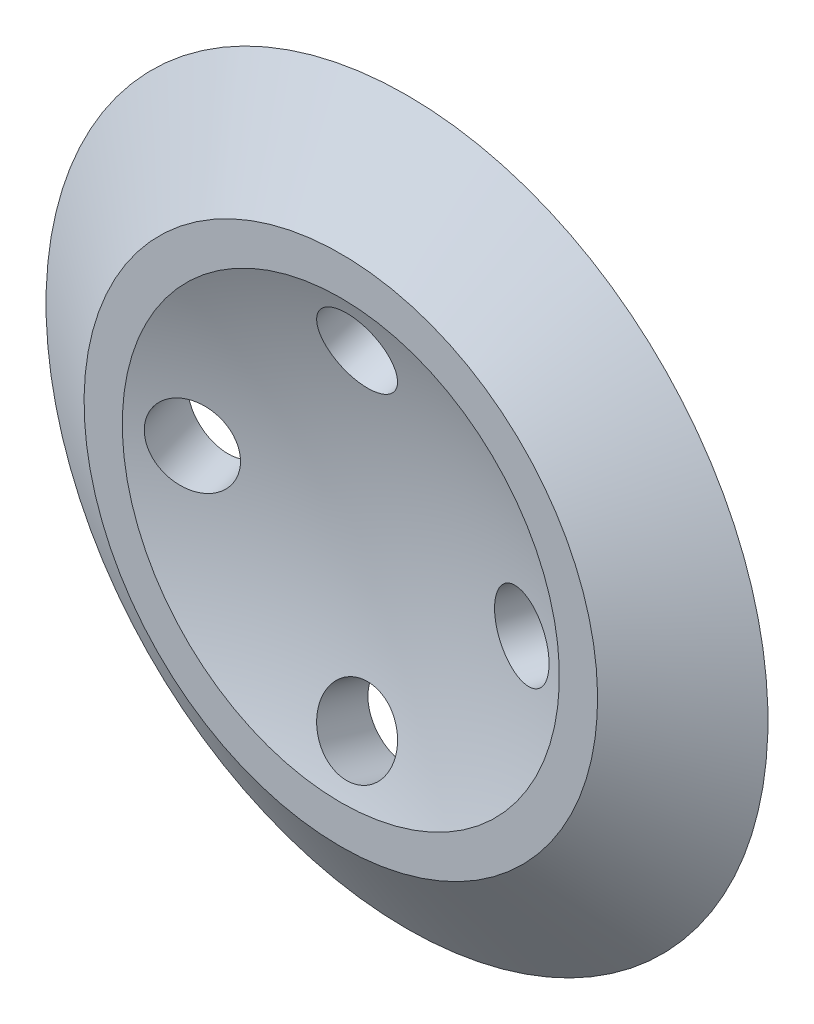
ISO-10303-21;
HEADER;
FILE_DESCRIPTION(('STEP AP214'),'2;1');
FILE_NAME('part.step','',(''),(''),'','','');
FILE_SCHEMA(('AUTOMOTIVE_DESIGN { 1 0 10303 214 1 1 1 1 }'));
ENDSEC;
DATA;
#1=APPLICATION_CONTEXT('core data for automotive mechanical design processes');
#2=APPLICATION_PROTOCOL_DEFINITION('international standard','automotive_design',2000,#1);
#3=PRODUCT_CONTEXT('',#1,'mechanical');
#4=PRODUCT('Part','Part','',(#3));
#5=PRODUCT_RELATED_PRODUCT_CATEGORY('part','',(#4));
#6=PRODUCT_DEFINITION_FORMATION('','',#4);
#7=PRODUCT_DEFINITION_CONTEXT('part definition',#1,'design');
#8=PRODUCT_DEFINITION('design','',#6,#7);
#9=PRODUCT_DEFINITION_SHAPE('','',#8);
#10=(LENGTH_UNIT() NAMED_UNIT(*) SI_UNIT(.MILLI.,.METRE.));
#11=(NAMED_UNIT(*) PLANE_ANGLE_UNIT() SI_UNIT($,.RADIAN.));
#12=(NAMED_UNIT(*) SI_UNIT($,.STERADIAN.) SOLID_ANGLE_UNIT());
#13=UNCERTAINTY_MEASURE_WITH_UNIT(LENGTH_MEASURE(1.E-05),#10,'distance_accuracy_value','');
#14=(GEOMETRIC_REPRESENTATION_CONTEXT(3) GLOBAL_UNCERTAINTY_ASSIGNED_CONTEXT((#13)) GLOBAL_UNIT_ASSIGNED_CONTEXT((#10,
#11,#12)) REPRESENTATION_CONTEXT('',''));
#15=CARTESIAN_POINT('',(0.,0.,0.));
#16=DIRECTION('',(0.,0.,1.));
#17=DIRECTION('',(1.,0.,0.));
#18=AXIS2_PLACEMENT_3D('',#15,#16,#17);
#19=CARTESIAN_POINT('',(0.,1.13216418099787,-5.5));
#20=DIRECTION('',(0.,0.,-1.));
#21=DIRECTION('',(0.,1.,0.));
#22=AXIS2_PLACEMENT_3D('',#19,#20,#21);
#23=CONICAL_SURFACE('',#22,60.,1.00497751363157);
#24=CARTESIAN_POINT('',(0.,1.13216418099783,5.5));
#25=DIRECTION('',(0.,0.,1.));
#26=DIRECTION('',(0.,-1.,0.));
#27=AXIS2_PLACEMENT_3D('',#24,#25,#26);
#28=CIRCLE('',#27,42.6794919243113);
#29=CARTESIAN_POINT('',(0.,-41.5473277433134,5.49999999999985));
#30=VERTEX_POINT('',#29);
#31=EDGE_CURVE('E10',#30,#30,#28,.T.);
#32=ORIENTED_EDGE('',*,*,#31,.F.);
#33=EDGE_LOOP('',(#32));
#34=FACE_BOUND('',#33,.T.);
#35=CARTESIAN_POINT('',(0.,1.13216418099787,-5.5));
#36=DIRECTION('',(0.,0.,1.));
#37=DIRECTION('',(0.,-1.,0.));
#38=AXIS2_PLACEMENT_3D('',#35,#36,#37);
#39=CIRCLE('',#38,60.);
#40=CARTESIAN_POINT('',(0.,-58.8678358190021,-5.50000000000021));
#41=VERTEX_POINT('',#40);
#42=EDGE_CURVE('E46',#41,#41,#39,.T.);
#43=ORIENTED_EDGE('',*,*,#42,.T.);
#44=EDGE_LOOP('',(#43));
#45=FACE_BOUND('',#44,.T.);
#46=ADVANCED_FACE('F34',(#34,#45),#23,.T.);
#47=CARTESIAN_POINT('',(0.,37.4582891310865,5.50000000000014));
#48=DIRECTION('',(0.,0.,-1.));
#49=DIRECTION('',(0.,1.,0.));
#50=AXIS2_PLACEMENT_3D('',#47,#48,#49);
#51=PLANE('',#50);
#52=CARTESIAN_POINT('',(0.,1.13216418099783,5.50000000000001));
#53=DIRECTION('',(0.,0.,1.));
#54=DIRECTION('',(0.,-1.,0.));
#55=AXIS2_PLACEMENT_3D('',#52,#53,#54);
#56=CIRCLE('',#55,36.3261249500886);
#57=CARTESIAN_POINT('',(0.,-35.1939607690908,5.49999999999988));
#58=VERTEX_POINT('',#57);
#59=EDGE_CURVE('E41',#58,#58,#56,.T.);
#60=ORIENTED_EDGE('',*,*,#59,.F.);
#61=EDGE_LOOP('',(#60));
#62=FACE_BOUND('',#61,.T.);
#63=ORIENTED_EDGE('',*,*,#31,.T.);
#64=EDGE_LOOP('',(#63));
#65=FACE_BOUND('',#64,.T.);
#66=ADVANCED_FACE('F120',(#62,#65),#51,.F.);
#67=CARTESIAN_POINT('',(0.,1.1321641809975,101.667835819002));
#68=DIRECTION('',(0.,0.,1.));
#69=DIRECTION('',(0.,1.,0.));
#70=AXIS2_PLACEMENT_3D('',#67,#68,#69);
#71=SPHERICAL_SURFACE('',#70,102.8);
#72=CARTESIAN_POINT('',(-3.26528690714912,-20.8304626244454,1.29442835856548));
#73=CARTESIAN_POINT('',(-3.10738949225979,-20.7420491868018,1.2699459754155));
#74=CARTESIAN_POINT('',(-2.94564168176089,-20.6600638275605,1.24724358872385));
#75=CARTESIAN_POINT('',(-2.61550575414756,-20.5094803839233,1.20554587046483));
#76=CARTESIAN_POINT('',(-2.4471159016714,-20.4408858263568,1.18655151550782));
#77=CARTESIAN_POINT('',(-2.10479101583131,-20.3175515366248,1.15239932133448));
#78=CARTESIAN_POINT('',(-1.93085117293428,-20.2628242101159,1.13724491734705));
#79=CARTESIAN_POINT('',(-1.57873928914634,-20.1676740614716,1.11089713832694));
#80=CARTESIAN_POINT('',(-1.40056572369977,-20.1272564781723,1.09970521396888));
#81=CARTESIAN_POINT('',(-1.04146916899541,-20.0610701324829,1.08137773320025));
#82=CARTESIAN_POINT('',(-0.860548627618744,-20.0352890331374,1.07423876059457));
#83=CARTESIAN_POINT('',(-0.497029921059985,-19.99849935436,1.06405143336842));
#84=CARTESIAN_POINT('',(-0.31443116194928,-19.9874962248979,1.06100458788419));
#85=CARTESIAN_POINT('',(0.0509659367665498,-19.9803607253702,1.05902871685423));
#86=CARTESIAN_POINT('',(0.233764083497001,-19.9842191765381,1.06009714964225));
#87=CARTESIAN_POINT('',(0.598441205958814,-20.0067629965848,1.06633969545889));
#88=CARTESIAN_POINT('',(0.780319817560297,-20.0254538369962,1.07151532359429));
#89=CARTESIAN_POINT('',(1.14174669069129,-20.0775291158329,1.08593534530725));
#90=CARTESIAN_POINT('',(1.3212955794088,-20.1109095114703,1.09517861940709));
#91=CARTESIAN_POINT('',(1.67690387060439,-20.1921407179141,1.11767213562312));
#92=CARTESIAN_POINT('',(1.85296196012223,-20.2399968673172,1.13092385603734));
#93=CARTESIAN_POINT('',(2.20021090906639,-20.349816751277,1.1613338010454));
#94=CARTESIAN_POINT('',(2.37140335457794,-20.4117758278806,1.17849073581446));
#95=CARTESIAN_POINT('',(2.70782699025656,-20.5493951375101,1.21659857245887));
#96=CARTESIAN_POINT('',(2.87305595603701,-20.6250604209076,1.23755087282523));
#97=CARTESIAN_POINT('',(3.19625056920159,-20.7895085310575,1.2830878424785));
#98=CARTESIAN_POINT('',(3.35421893019861,-20.8782864039091,1.30767113998452));
#99=CARTESIAN_POINT('',(3.66189068158555,-21.0683811504519,1.36030990979261));
#100=CARTESIAN_POINT('',(3.81159099909894,-21.1697026413174,1.38836666063645));
#101=CARTESIAN_POINT('',(4.10155434819067,-21.3841123891801,1.44773850961088));
#102=CARTESIAN_POINT('',(4.24182086000782,-21.4971962672555,1.47905239516978));
#103=CARTESIAN_POINT('',(4.51199670572761,-21.7343490247865,1.54472204616472));
#104=CARTESIAN_POINT('',(4.64190219650903,-21.8584219446274,1.57907893043245));
#105=CARTESIAN_POINT('',(5.01454324465484,-22.2457691868821,1.68633886425087));
#106=CARTESIAN_POINT('',(5.24050812853158,-22.5243977578929,1.76349371122603));
#107=CARTESIAN_POINT('',(5.6405634979542,-23.1141125905778,1.92679149386535));
#108=CARTESIAN_POINT('',(5.81465406541787,-23.4251988009951,2.01293441533563));
#109=CARTESIAN_POINT('',(6.10621657457308,-24.0711742831143,2.19181186256911));
#110=CARTESIAN_POINT('',(6.22368620490389,-24.4060645258961,2.28454665724623));
#111=CARTESIAN_POINT('',(6.39861180528878,-25.0900874444908,2.47396046050377));
#112=CARTESIAN_POINT('',(6.45606770045165,-25.4392201380763,2.57063947400602));
#113=CARTESIAN_POINT('',(6.50934951173117,-26.1418395950878,2.76520353428644));
#114=CARTESIAN_POINT('',(6.50517358263654,-26.4953264885587,2.86308861708578));
#115=CARTESIAN_POINT('',(6.43530210958524,-27.1966065236469,3.05728244347064));
#116=CARTESIAN_POINT('',(6.36960658569041,-27.5443996671208,3.15359118757021));
#117=CARTESIAN_POINT('',(6.17856069145566,-28.2244227606802,3.34189932017412));
#118=CARTESIAN_POINT('',(6.05320990566092,-28.5566526023611,3.43389867866187));
#119=CARTESIAN_POINT('',(5.74641067445013,-29.1961147700783,3.61097548281315));
#120=CARTESIAN_POINT('',(5.56496222562398,-29.5033470945949,3.6960529280559));
#121=CARTESIAN_POINT('',(5.15112193234099,-30.0840861064283,3.85686887771467));
#122=CARTESIAN_POINT('',(4.91873108766984,-30.3575934554604,3.93260756536578));
#123=CARTESIAN_POINT('',(4.40960022163822,-30.8631242242321,4.07259751846418));
#124=CARTESIAN_POINT('',(4.1328602105923,-31.0951476536199,4.13684878658317));
#125=CARTESIAN_POINT('',(3.54289784305338,-31.5111148130411,4.2520373333132));
#126=CARTESIAN_POINT('',(3.22967685110113,-31.695060340554,4.30297510967328));
#127=CARTESIAN_POINT('',(2.57563559495907,-32.0096601370761,4.39009342510066));
#128=CARTESIAN_POINT('',(2.2348153356812,-32.1403144155696,4.42627396679435));
#129=CARTESIAN_POINT('',(1.53526466106945,-32.3446177553654,4.48284929078603));
#130=CARTESIAN_POINT('',(1.17653494073508,-32.4182690269146,4.50324468514074));
#131=CARTESIAN_POINT('',(0.451336776608307,-32.506483343237,4.5276728570262));
#132=CARTESIAN_POINT('',(0.0848683350721981,-32.5210464052377,4.53170563932755));
#133=CARTESIAN_POINT('',(-0.645395110461542,-32.4906714867304,4.52329426273511));
#134=CARTESIAN_POINT('',(-1.00919017679056,-32.445734897948,4.51085048923589));
#135=CARTESIAN_POINT('',(-1.72378918367539,-32.2976378700877,4.46983970170879));
#136=CARTESIAN_POINT('',(-2.07459311934103,-32.1944774090933,4.44127268161182));
#137=CARTESIAN_POINT('',(-2.75325074051901,-31.9328655880651,4.36882763528559));
#138=CARTESIAN_POINT('',(-3.08110436151609,-31.774414072611,4.32494956601777));
#139=CARTESIAN_POINT('',(-3.70456136689737,-31.4067030469957,4.22312388735304));
#140=CARTESIAN_POINT('',(-4.00016478156646,-31.1974435845467,4.16517629116844));
#141=CARTESIAN_POINT('',(-4.55071162644868,-30.7341109481176,4.03687156037842));
#142=CARTESIAN_POINT('',(-4.8056539682775,-30.4800365749495,3.96651409370127));
#143=CARTESIAN_POINT('',(-5.26773679437821,-29.9340668715293,3.81532611985376));
#144=CARTESIAN_POINT('',(-5.47487718244424,-29.6421714651607,3.73449559160591));
#145=CARTESIAN_POINT('',(-5.74513918099532,-29.1826320846994,3.60724195408692));
#146=CARTESIAN_POINT('',(-5.82852013231635,-29.025743079739,3.56379696824957));
#147=CARTESIAN_POINT('',(-5.98127173671131,-28.7057721814185,3.47519216084436));
#148=CARTESIAN_POINT('',(-6.05064754828477,-28.5426925946204,3.43003297797299));
#149=CARTESIAN_POINT('',(-6.17491554267926,-28.2114306248875,3.33830164742787));
#150=CARTESIAN_POINT('',(-6.22980233744674,-28.0432463695213,3.29172898127799));
#151=CARTESIAN_POINT('',(-6.32466192602473,-27.7030791886557,3.19753182121136));
#152=CARTESIAN_POINT('',(-6.36464021586877,-27.5310976878292,3.14990772177801));
#153=CARTESIAN_POINT('',(-6.42943800459197,-27.1844280658183,3.05391010397115));
#154=CARTESIAN_POINT('',(-6.45425108239493,-27.0097388302104,3.00553627703287));
#155=CARTESIAN_POINT('',(-6.48850992133997,-26.6590312987048,2.90842067179278));
#156=CARTESIAN_POINT('',(-6.49796135036181,-26.4830135170845,2.85967903587055));
#157=CARTESIAN_POINT('',(-6.50144776973854,-26.1307780398438,2.76214049005597));
#158=CARTESIAN_POINT('',(-6.4954776717194,-25.9545602974205,2.71334356723129));
#159=CARTESIAN_POINT('',(-6.46815784018242,-25.6033010791958,2.61607552791962));
#160=CARTESIAN_POINT('',(-6.44681378429279,-25.4282591932283,2.56760429782174));
#161=CARTESIAN_POINT('',(-6.3888958569247,-25.0804811556389,2.4713004052485));
#162=CARTESIAN_POINT('',(-6.35231773131354,-24.9077456619966,2.42346792499855));
#163=CARTESIAN_POINT('',(-6.26420758530123,-24.5659218082459,2.32881297700467));
#164=CARTESIAN_POINT('',(-6.21268108684683,-24.3968321261048,2.28199014314546));
#165=CARTESIAN_POINT('',(-6.09499853875623,-24.0633323194751,2.18964037207171));
#166=CARTESIAN_POINT('',(-6.02883346814038,-23.898925151397,2.14411425356653));
#167=CARTESIAN_POINT('',(-5.88238984820189,-23.5761287644914,2.05472852113735));
#168=CARTESIAN_POINT('',(-5.80211650993373,-23.417737349853,2.01086829914405));
#169=CARTESIAN_POINT('',(-5.62793732619961,-23.1079050006905,1.92507257877314));
#170=CARTESIAN_POINT('',(-5.53402016537821,-22.9564699739343,1.88313871637077));
#171=CARTESIAN_POINT('',(-5.33330962789378,-22.661824522151,1.80154852285108));
#172=CARTESIAN_POINT('',(-5.22652097195217,-22.51861111006,1.7618913645651));
#173=CARTESIAN_POINT('',(-5.00089740895624,-22.2414894951082,1.68515379957949));
#174=CARTESIAN_POINT('',(-4.88207332131387,-22.1075731139467,1.64807112818548));
#175=CARTESIAN_POINT('',(-4.63318841907889,-21.8498991786982,1.57671890100782));
#176=CARTESIAN_POINT('',(-4.5031305686481,-21.7261389614922,1.5424486077707));
#177=CARTESIAN_POINT('',(-4.19896436644312,-21.4601447013591,1.46879249701068));
#178=CARTESIAN_POINT('',(-4.02194942853555,-21.3209803322209,1.43025670928576));
#179=CARTESIAN_POINT('',(-3.65372097192077,-21.0613553544633,1.35836440585106));
#180=CARTESIAN_POINT('',(-3.46250745334205,-20.9408947456747,1.32500789009439));
#181=CARTESIAN_POINT('',(-3.26528690714912,-20.8304626244454,1.29442835856548));
#182=B_SPLINE_CURVE_WITH_KNOTS('',3,(#72,#73,#74,#75,#76,#77,#78,#79,#80,#81,#82,#83,#84,#85,
#86,#87,#88,#89,#90,#91,#92,#93,#94,#95,#96,#97,#98,#99,#100,#101,#102,#103,#104,#105,#106,#107,
#108,#109,#110,#111,#112,#113,#114,#115,#116,#117,#118,#119,#120,#121,#122,#123,#124,#125,#126,
#127,#128,#129,#130,#131,#132,#133,#134,#135,#136,#137,#138,#139,#140,#141,#142,#143,#144,#145,
#146,#147,#148,#149,#150,#151,#152,#153,#154,#155,#156,#157,#158,#159,#160,#161,#162,#163,#164,
#165,#166,#167,#168,#169,#170,#171,#172,#173,#174,#175,#176,#177,#178,#179,#180,#181),
.UNSPECIFIED.,.T.,.F.,(4,2,2,2,2,2,2,2,2,2,2,2,2,2,2,2,2,2,2,2,2,2,2,2,2,2,2,2,2,2,2,2,2,2,2,2,
2,2,2,2,2,2,2,2,2,2,2,2,2,2,2,2,2,2,4),(0.,0.547643134037494,1.09543031066958,1.64370582243297,
2.19218185230327,2.74019488785095,3.2884099697712,3.83628651898708,4.38436526885068,
4.93229327339164,5.48042359834342,6.0283731473473,6.57652501337938,7.12447031632897,
7.67261791525406,8.2205621743059,8.7687087412715,9.86386325592623,10.9590160411489,
12.0542135285425,13.149412382633,14.2446440262345,15.3398753126757,16.4351142267049,
17.5303532073123,18.6255706948935,19.7207879277532,20.8159642080706,21.911140293476,
23.0062739121595,24.1014072115516,25.1965148957016,26.2916229920704,27.386734166756,
28.4818443130576,29.5769837675067,30.6721254260058,31.220305458421,31.7682832103326,
32.3164644534438,32.864443408808,33.4126542225475,33.9606627208351,34.5088520590852,
35.0568390538293,35.6049791773295,36.1529170744804,36.7011935820627,37.2492680012482,
37.7977995826722,38.3461305945244,38.8939729796016,39.4416712489828,40.1257006807937,
40.809730106414),.UNSPECIFIED.);
#183=CARTESIAN_POINT('',(-3.26528690714912,-20.8304626244454,1.29442835856548));
#184=VERTEX_POINT('',#183);
#185=EDGE_CURVE('E60',#184,#184,#182,.T.);
#186=ORIENTED_EDGE('',*,*,#185,.T.);
#187=EDGE_LOOP('',(#186));
#188=FACE_BOUND('',#187,.T.);
#189=CARTESIAN_POINT('',(-32.4072315263735,5.009532250093,4.1866716812428));
#190=CARTESIAN_POINT('',(-32.302241190766,5.15610628933347,4.15759803253653));
#191=CARTESIAN_POINT('',(-32.1913055438153,5.29806832223738,4.12687803860225));
#192=CARTESIAN_POINT('',(-31.9582737931682,5.57184378448388,4.0623475664251));
#193=CARTESIAN_POINT('',(-31.8361747595524,5.70365453272125,4.02853627684721));
#194=CARTESIAN_POINT('',(-31.5816019986341,5.95624997456258,3.95804081506238));
#195=CARTESIAN_POINT('',(-31.4491191121877,6.07702472575731,3.92135410657426));
#196=CARTESIAN_POINT('',(-31.1747645213773,6.30660170464757,3.84538082301476));
#197=CARTESIAN_POINT('',(-31.03288940067,6.41539953709913,3.80609330192063));
#198=CARTESIAN_POINT('',(-30.7409283973175,6.62010959086537,3.72524462614998));
#199=CARTESIAN_POINT('',(-30.5908495690693,6.71603264538334,3.68368542489997));
#200=CARTESIAN_POINT('',(-30.2833813880843,6.89445310157523,3.59854268818343));
#201=CARTESIAN_POINT('',(-30.1259893604685,6.97694554037659,3.55495841202475));
#202=CARTESIAN_POINT('',(-29.8051651662672,7.12782845377398,3.46611732347872));
#203=CARTESIAN_POINT('',(-29.6417367901571,7.19622760639339,3.4208615606883));
#204=CARTESIAN_POINT('',(-29.309847999314,7.31852477425985,3.32895666415311));
#205=CARTESIAN_POINT('',(-29.1413857496592,7.37241742823029,3.28230702231899));
#206=CARTESIAN_POINT('',(-28.8007250777143,7.46527415539406,3.18797321799141));
#207=CARTESIAN_POINT('',(-28.6285275501442,7.50424176279356,3.14028930324003));
#208=CARTESIAN_POINT('',(-28.2815172060956,7.56700126203371,3.04419734550159));
#209=CARTESIAN_POINT('',(-28.1067034473864,7.59078754484514,2.9957890416279));
#210=CARTESIAN_POINT('',(-27.7558239759834,7.62298709058183,2.89862583531137));
#211=CARTESIAN_POINT('',(-27.579758694971,7.63140541839038,2.84987105237913));
#212=CARTESIAN_POINT('',(-27.2275054795002,7.6328251421055,2.75232760609081));
#213=CARTESIAN_POINT('',(-27.0513175237577,7.62582084457865,2.70353893687183));
#214=CARTESIAN_POINT('',(-26.7002006484859,7.596438157475,2.60631032507916));
#215=CARTESIAN_POINT('',(-26.5252712907188,7.57406540980158,2.55787026112119));
#216=CARTESIAN_POINT('',(-26.1777888049689,7.5141022423414,2.46164822131215));
#217=CARTESIAN_POINT('',(-26.0052365781434,7.47650620718599,2.41386649503247));
#218=CARTESIAN_POINT('',(-25.663851393656,7.38637044693232,2.31933303023782));
#219=CARTESIAN_POINT('',(-25.4950170797245,7.33383627183046,2.27258091612677));
#220=CARTESIAN_POINT('',(-25.1621909721336,7.21420684049175,2.18041770994608));
#221=CARTESIAN_POINT('',(-24.9982009893377,7.14710621548936,2.13500711935214));
#222=CARTESIAN_POINT('',(-24.5154032269211,6.92464750176625,2.00131532868938));
#223=CARTESIAN_POINT('',(-24.205395403292,6.7480339228649,1.91547103502918));
#224=CARTESIAN_POINT('',(-23.6185307479941,6.34339571379731,1.75296251501746));
#225=CARTESIAN_POINT('',(-23.3416738522197,6.11537118304955,1.67629827091399));
#226=CARTESIAN_POINT('',(-22.8287463638095,5.61431081572208,1.53426405391319));
#227=CARTESIAN_POINT('',(-22.5926745906269,5.34127628242789,1.46889375410667));
#228=CARTESIAN_POINT('',(-22.1680722624976,4.75796261609678,1.35131783595904));
#229=CARTESIAN_POINT('',(-21.9795417474893,4.44768345177166,1.29911222867735));
#230=CARTESIAN_POINT('',(-21.6553655449328,3.79869647348368,1.20934530556742));
#231=CARTESIAN_POINT('',(-21.5197177065485,3.45998981640045,1.17178339415307));
#232=CARTESIAN_POINT('',(-21.3051521575157,2.76375373036727,1.11236859596657));
#233=CARTESIAN_POINT('',(-21.2262344121672,2.40622431293075,1.09051569958572));
#234=CARTESIAN_POINT('',(-21.1273703609794,1.68250424114431,1.06313952875175));
#235=CARTESIAN_POINT('',(-21.1074220772708,1.31631387770273,1.05761570661218));
#236=CARTESIAN_POINT('',(-21.1270580676958,0.585655730279462,1.06305305332476));
#237=CARTESIAN_POINT('',(-21.1666423432648,0.221187946339312,1.07401422257441));
#238=CARTESIAN_POINT('',(-21.3042185302783,-0.495674236385249,1.11211007111505));
#239=CARTESIAN_POINT('',(-21.4022097252962,-0.848068783205409,1.13924455202221));
#240=CARTESIAN_POINT('',(-21.6538168785282,-1.53078610596985,1.20891647253721));
#241=CARTESIAN_POINT('',(-21.8074328364751,-1.86110888202015,1.25145391207106));
#242=CARTESIAN_POINT('',(-22.1659307245271,-2.4903112478754,1.35072483293342));
#243=CARTESIAN_POINT('',(-22.3708134029773,-2.78919037860399,1.40745852148594));
#244=CARTESIAN_POINT('',(-22.8260269322596,-3.34701682947725,1.53351102574529));
#245=CARTESIAN_POINT('',(-23.0763577928392,-3.60596414105753,1.6028298441513));
#246=CARTESIAN_POINT('',(-23.6153707423388,-4.07658604928105,1.75208748618833));
#247=CARTESIAN_POINT('',(-23.9040541752259,-4.28825898861857,1.8320266819831));
#248=CARTESIAN_POINT('',(-24.5115704963253,-4.6583131188517,2.0002540110806));
#249=CARTESIAN_POINT('',(-24.8304033873566,-4.81669430476473,2.08854214516392));
#250=CARTESIAN_POINT('',(-25.4891813444104,-5.07567574117192,2.27096489958715));
#251=CARTESIAN_POINT('',(-25.8291272526834,-5.17627368490709,2.36509975316715));
#252=CARTESIAN_POINT('',(-26.5204710559868,-5.31682309488275,2.556540977556));
#253=CARTESIAN_POINT('',(-26.871868957722,-5.35677452561591,2.65384735022168));
#254=CARTESIAN_POINT('',(-27.5761484535123,-5.37490062173398,2.84887128760194));
#255=CARTESIAN_POINT('',(-27.9290300886328,-5.35307356588061,2.94658886369751));
#256=CARTESIAN_POINT('',(-28.6262626245415,-5.24824609117141,3.1396620720438));
#257=CARTESIAN_POINT('',(-28.9706135338417,-5.16524573335753,3.23501770665131));
#258=CARTESIAN_POINT('',(-29.6409626262811,-4.94047321595682,3.42064714484066));
#259=CARTESIAN_POINT('',(-29.966960761964,-4.79870090440608,3.51092093528194));
#260=CARTESIAN_POINT('',(-30.591528405491,-4.46023545319561,3.68387337174347));
#261=CARTESIAN_POINT('',(-30.8900978663655,-4.26354221949012,3.76655200475758));
#262=CARTESIAN_POINT('',(-31.3106679887659,-3.93186572840365,3.88301471203297));
#263=CARTESIAN_POINT('',(-31.4463746434511,-3.81512998964658,3.92059411867851));
#264=CARTESIAN_POINT('',(-31.7078201991124,-3.5702284221135,3.99299274126533));
#265=CARTESIAN_POINT('',(-31.8335627609235,-3.44206682834977,4.02781297093567));
#266=CARTESIAN_POINT('',(-32.0742307909159,-3.17516640747523,4.09445803300466));
#267=CARTESIAN_POINT('',(-32.1891522274242,-3.03642367267519,4.12628174897929));
#268=CARTESIAN_POINT('',(-32.4072823645715,-2.7494349098083,4.18668575390623));
#269=CARTESIAN_POINT('',(-32.5104953729909,-2.60119240852821,4.21526723574558));
#270=CARTESIAN_POINT('',(-32.7045538127721,-2.2961603580348,4.26900542571374));
#271=CARTESIAN_POINT('',(-32.7953949129148,-2.13936784235361,4.29416093446079));
#272=CARTESIAN_POINT('',(-32.9639905967301,-1.81845711030918,4.34084808132252));
#273=CARTESIAN_POINT('',(-33.0417499988874,-1.65434161958097,4.3623810537544));
#274=CARTESIAN_POINT('',(-33.1836934663127,-1.31984235531677,4.40168775732604));
#275=CARTESIAN_POINT('',(-33.2478730466396,-1.14945653265119,4.41946024650943));
#276=CARTESIAN_POINT('',(-33.362146839944,-0.803743442944671,4.451104738812));
#277=CARTESIAN_POINT('',(-33.4122462439995,-0.628418023332696,4.46497817943203));
#278=CARTESIAN_POINT('',(-33.4980447795115,-0.273971294689282,4.48873736622857));
#279=CARTESIAN_POINT('',(-33.5337406434165,-0.0948491340281511,4.49862220756135));
#280=CARTESIAN_POINT('',(-33.590451472852,0.265812200699263,4.51432648099655));
#281=CARTESIAN_POINT('',(-33.6114718503501,0.447350458571847,4.52014741177171));
#282=CARTESIAN_POINT('',(-33.6387120265798,0.811731668740003,4.52769071995094));
#283=CARTESIAN_POINT('',(-33.6449226724795,0.994575357860543,4.52941056276694));
#284=CARTESIAN_POINT('',(-33.6424729481313,1.36008785036604,4.5287321888024));
#285=CARTESIAN_POINT('',(-33.6338180579619,1.54275669337021,4.52633548955704));
#286=CARTESIAN_POINT('',(-33.6016958950573,1.90683921815287,4.51744026925358));
#287=CARTESIAN_POINT('',(-33.5782163966347,2.08825173889908,4.51093836267728));
#288=CARTESIAN_POINT('',(-33.5166128319151,2.44831026971883,4.49387920152158));
#289=CARTESIAN_POINT('',(-33.4784941229889,2.6269572670125,4.4833234304959));
#290=CARTESIAN_POINT('',(-33.3879213814368,2.98012736791861,4.45824218029016));
#291=CARTESIAN_POINT('',(-33.3354801536128,3.15465400456269,4.44372024698938));
#292=CARTESIAN_POINT('',(-33.2166429821426,3.49845057651696,4.41081207559675));
#293=CARTESIAN_POINT('',(-33.1502507130844,3.66772188258936,4.39242685506262));
#294=CARTESIAN_POINT('',(-32.9857524173831,4.04121359279312,4.34687431832719));
#295=CARTESIAN_POINT('',(-32.8838656987217,4.24365441518228,4.31866006448083));
#296=CARTESIAN_POINT('',(-32.6601529569824,4.63630444760043,4.25671004435817));
#297=CARTESIAN_POINT('',(-32.5383269340821,4.82651365773842,4.22297427813107));
#298=CARTESIAN_POINT('',(-32.4072315263735,5.009532250093,4.1866716812428));
#299=B_SPLINE_CURVE_WITH_KNOTS('',3,(#189,#190,#191,#192,#193,#194,#195,#196,#197,#198,#199,
#200,#201,#202,#203,#204,#205,#206,#207,#208,#209,#210,#211,#212,#213,#214,#215,#216,#217,#218,
#219,#220,#221,#222,#223,#224,#225,#226,#227,#228,#229,#230,#231,#232,#233,#234,#235,#236,#237,
#238,#239,#240,#241,#242,#243,#244,#245,#246,#247,#248,#249,#250,#251,#252,#253,#254,#255,#256,
#257,#258,#259,#260,#261,#262,#263,#264,#265,#266,#267,#268,#269,#270,#271,#272,#273,#274,#275,
#276,#277,#278,#279,#280,#281,#282,#283,#284,#285,#286,#287,#288,#289,#290,#291,#292,#293,#294,
#295,#296,#297,#298),.UNSPECIFIED.,.T.,.F.,(4,2,2,2,2,2,2,2,2,2,2,2,2,2,2,2,2,2,2,2,2,2,2,2,2,2,
2,2,2,2,2,2,2,2,2,2,2,2,2,2,2,2,2,2,2,2,2,2,2,2,2,2,2,2,4),(0.,0.547678314889684,
1.09550078719962,1.64381202862507,2.19232382111888,2.74037114749618,3.28862053058173,
3.83653131033066,4.38464430845279,4.93262743470218,5.48081290671881,6.02881767824253,
6.5770247857295,7.12503074868097,7.67323903736997,8.22124391468849,8.76945111447355,
9.86468467721383,10.9599161220098,12.055115859439,13.1503165169221,14.2454726259267,
15.3406280650585,16.4357467716357,17.5308655046197,18.6259708050186,19.7210761001572,
20.8161973815849,21.9113188978883,23.006478800029,24.1016388045628,25.1968425258306,
26.2920468883182,27.3872817650891,28.4825155489783,29.5777521647803,30.6729906560603,
31.2211848177494,31.7691766284751,32.31737180564,32.8653646314312,33.4135488108336,
33.9615306290588,34.5096931450393,35.0576532986048,35.605737691257,36.153619856614,
36.7018405409481,37.2498591708353,37.7983303368768,38.3466009751862,38.8943830371004,
39.4420209982249,40.1258754902406,40.8097299761622),.UNSPECIFIED.);
#300=CARTESIAN_POINT('',(-32.4072315263735,5.009532250093,4.1866716812428));
#301=VERTEX_POINT('',#300);
#302=EDGE_CURVE('E57',#301,#301,#299,.T.);
#303=ORIENTED_EDGE('',*,*,#302,.T.);
#304=EDGE_LOOP('',(#303));
#305=FACE_BOUND('',#304,.T.);
#306=CARTESIAN_POINT('',(-3.87736806909526,33.5393957073714,4.18667168124289));
#307=CARTESIAN_POINT('',(-3.73080380909475,33.6443821859391,4.21574426196189));
#308=CARTESIAN_POINT('',(-3.57966257582688,33.7433992925162,4.24316383464154));
#309=CARTESIAN_POINT('',(-3.2692178357398,33.9288519345965,4.29451894418618));
#310=CARTESIAN_POINT('',(-3.10991219259654,34.0152841541405,4.3184535628097));
#311=CARTESIAN_POINT('',(-2.78417216068642,34.174983588058,4.36267719184861));
#312=CARTESIAN_POINT('',(-2.6177315436864,34.2482389979758,4.38296293341441));
#313=CARTESIAN_POINT('',(-2.27897364747867,34.3809954923082,4.41972560696203));
#314=CARTESIAN_POINT('',(-2.10665424130922,34.4404915366678,4.43620114326583));
#315=CARTESIAN_POINT('',(-1.75757182647595,34.5452262536102,4.46520409686424));
#316=CARTESIAN_POINT('',(-1.58081269013709,34.5904769145671,4.47773483395217));
#317=CARTESIAN_POINT('',(-1.22390140587528,34.6664815840278,4.49878192260863));
#318=CARTESIAN_POINT('',(-1.04374803101184,34.6972302416172,4.50729679241209));
#319=CARTESIAN_POINT('',(-0.681505454662926,34.7439728584918,4.52024068526477));
#320=CARTESIAN_POINT('',(-0.499417517294409,34.7599759174223,4.52467222817276));
#321=CARTESIAN_POINT('',(-0.134422598967603,34.7771494589085,4.52942789934661));
#322=CARTESIAN_POINT('',(0.0484846594656466,34.7783144651722,4.52975051112599));
#323=CARTESIAN_POINT('',(0.413699339046014,34.7657912364069,4.52628259754062));
#324=CARTESIAN_POINT('',(0.596006914234069,34.752107172931,4.5224932273561));
#325=CARTESIAN_POINT('',(0.958845435053426,34.70998188504,4.51082795747684));
#326=CARTESIAN_POINT('',(1.13937569981332,34.6815352134543,4.50295054936031));
#327=CARTESIAN_POINT('',(1.49724818750609,34.6100956948659,4.48316763367856));
#328=CARTESIAN_POINT('',(1.67459144235711,34.5671076489404,4.47126345561855));
#329=CARTESIAN_POINT('',(2.02495532808646,34.4668704823475,4.44350595377148));
#330=CARTESIAN_POINT('',(2.19797433877428,34.4096161020177,4.42765117349016));
#331=CARTESIAN_POINT('',(2.53832618712809,34.2812854374915,4.39211408864202));
#332=CARTESIAN_POINT('',(2.70566119310325,34.2102144951466,4.37243326332631));
#333=CARTESIAN_POINT('',(3.03358378292973,34.0547165245107,4.32937308925664));
#334=CARTESIAN_POINT('',(3.19416885290078,33.9702845749899,4.30599237773188));
#335=CARTESIAN_POINT('',(3.50733646761688,33.7887046879352,4.25570969527345));
#336=CARTESIAN_POINT('',(3.65992195916009,33.6915614795966,4.22880903392917));
#337=CARTESIAN_POINT('',(3.95608503115968,33.4852360365313,4.17167392362003));
#338=CARTESIAN_POINT('',(4.09965926499246,33.3760493701011,4.14143824744973));
#339=CARTESIAN_POINT('',(4.5151808851219,33.0316056193545,4.04605587253858));
#340=CARTESIAN_POINT('',(4.77225834668207,32.7792723803107,3.97618054748653));
#341=CARTESIAN_POINT('',(5.23866141273724,32.2367260504023,3.82594054390191));
#342=CARTESIAN_POINT('',(5.44798709324832,31.9465130198397,3.74557588206765));
#343=CARTESIAN_POINT('',(5.81316147299119,31.3362920103161,3.57659612374404));
#344=CARTESIAN_POINT('',(5.96900802293214,31.0162828345248,3.48798069584378));
#345=CARTESIAN_POINT('',(6.22273417999867,30.3556006658247,3.30502802180417));
#346=CARTESIAN_POINT('',(6.32061371358703,30.0149276467022,3.21069076840624));
#347=CARTESIAN_POINT('',(6.45564519733039,29.3225658319573,3.0189661673404));
#348=CARTESIAN_POINT('',(6.49279501027637,28.9708766490962,2.92157871245227));
#349=CARTESIAN_POINT('',(6.50530210737929,28.2664799119399,2.72652214238335));
#350=CARTESIAN_POINT('',(6.480659408878,27.9137723579304,2.62885302728162));
#351=CARTESIAN_POINT('',(6.37028105183139,27.2173445151395,2.43600380985344));
#352=CARTESIAN_POINT('',(6.28454442834658,26.8736243683972,2.34082374686459));
#353=CARTESIAN_POINT('',(6.0544101109031,26.2049347566734,2.15565619836029));
#354=CARTESIAN_POINT('',(5.91001241044759,25.8799652937684,2.06566871341993));
#355=CARTESIAN_POINT('',(5.56665624229722,25.2580061407378,1.89344189130769));
#356=CARTESIAN_POINT('',(5.36769838164,24.9610161393615,1.81120246794437));
#357=CARTESIAN_POINT('',(4.92086829474946,24.4034435990369,1.65680540157079));
#358=CARTESIAN_POINT('',(4.67299607831076,24.1428610527985,1.58464775654175));
#359=CARTESIAN_POINT('',(4.1353822142234,23.6655099649981,1.45246509877363));
#360=CARTESIAN_POINT('',(3.84564194800837,23.4487399784093,1.39243968588901));
#361=CARTESIAN_POINT('',(3.23251050103116,23.0651580893133,1.28622275739771));
#362=CARTESIAN_POINT('',(2.90911932624139,22.8983461779395,1.24003123933577));
#363=CARTESIAN_POINT('',(2.2378802410694,22.6194227691229,1.16279521648248));
#364=CARTESIAN_POINT('',(1.89003331913557,22.5073090623496,1.13175009990854));
#365=CARTESIAN_POINT('',(1.1797457769481,22.3409555583264,1.08568559411005));
#366=CARTESIAN_POINT('',(0.817305161406759,22.2867157423892,1.07066619971084));
#367=CARTESIAN_POINT('',(0.0881307318145031,22.2376506205349,1.05707971466953));
#368=CARTESIAN_POINT('',(-0.278602951889158,22.2428235153636,1.05851212580107));
#369=CARTESIAN_POINT('',(-1.00596446400483,22.3124336704803,1.07778767925407));
#370=CARTESIAN_POINT('',(-1.36659229041875,22.3768709501616,1.09563082694569));
#371=CARTESIAN_POINT('',(-2.07150006712701,22.5631756045595,1.14721996039795));
#372=CARTESIAN_POINT('',(-2.41578012035317,22.6850426176238,1.18096584601426));
#373=CARTESIAN_POINT('',(-3.07823110068872,22.9827614289365,1.26340647964124));
#374=CARTESIAN_POINT('',(-3.39640205349979,23.1586131740417,1.3121012129361));
#375=CARTESIAN_POINT('',(-3.99757584271057,23.559256349982,1.42304258670598));
#376=CARTESIAN_POINT('',(-4.28057799548439,23.784048731912,1.48528949054908));
#377=CARTESIAN_POINT('',(-4.80350349950211,24.2764006162239,1.62162605526998));
#378=CARTESIAN_POINT('',(-5.04342676499706,24.5439602037324,1.6957157397204));
#379=CARTESIAN_POINT('',(-5.36565522559567,24.9712463634605,1.8140353417234));
#380=CARTESIAN_POINT('',(-5.46683425223389,25.1180881263337,1.85469725028669));
#381=CARTESIAN_POINT('',(-5.65599483775002,25.4194452914383,1.93814603569342));
#382=CARTESIAN_POINT('',(-5.74398125273121,25.5739578420942,1.98093212288465));
#383=CARTESIAN_POINT('',(-5.90615896692878,25.8896247878891,2.06834356062438));
#384=CARTESIAN_POINT('',(-5.9803451312127,26.0507816281615,2.11296958828084));
#385=CARTESIAN_POINT('',(-6.11434238241797,26.3784880344596,2.20371502018035));
#386=CARTESIAN_POINT('',(-6.17415876373711,26.5450355885894,2.24983386728093));
#387=CARTESIAN_POINT('',(-6.27904585404326,26.8824654981014,2.34327199404267));
#388=CARTESIAN_POINT('',(-6.3241102603447,27.0533496727674,2.390591777517));
#389=CARTESIAN_POINT('',(-6.39912500251278,27.3981060955477,2.48605885733005));
#390=CARTESIAN_POINT('',(-6.42908090987527,27.5719772176838,2.53420584184256));
#391=CARTESIAN_POINT('',(-6.47369796106809,27.9215909232501,2.63101812480032));
#392=CARTESIAN_POINT('',(-6.48835405416582,28.0973341053507,2.67968358905227));
#393=CARTESIAN_POINT('',(-6.50224729870482,28.4493205418586,2.77715307773767));
#394=CARTESIAN_POINT('',(-6.50149013925597,28.6255635877478,2.82595704439892));
#395=CARTESIAN_POINT('',(-6.48457375111062,28.9774126496795,2.92338865995946));
#396=CARTESIAN_POINT('',(-6.46841009602906,29.1530184680874,2.97201625415531));
#397=CARTESIAN_POINT('',(-6.42079801325072,29.5022288792347,3.06871735878302));
#398=CARTESIAN_POINT('',(-6.3893552265711,29.6758341863609,3.11679106700775));
#399=CARTESIAN_POINT('',(-6.31138656285447,30.019982553771,3.21209058469171));
#400=CARTESIAN_POINT('',(-6.26485137651235,30.1905236552901,3.25931585179115));
#401=CARTESIAN_POINT('',(-6.15705435004966,30.5271577656393,3.35253472151195));
#402=CARTESIAN_POINT('',(-6.09579794414122,30.6932523907616,3.39852877167975));
#403=CARTESIAN_POINT('',(-5.95892684027759,31.0200162471919,3.48901457170217));
#404=CARTESIAN_POINT('',(-5.88330008180738,31.1806807868552,3.53350502243127));
#405=CARTESIAN_POINT('',(-5.71829125741534,31.4952348514225,3.62060988516701));
#406=CARTESIAN_POINT('',(-5.62891423104226,31.6491268320379,3.66322497717338));
#407=CARTESIAN_POINT('',(-5.43710330538776,31.9489720018203,3.7462568453283));
#408=CARTESIAN_POINT('',(-5.33468111162386,32.0949321427942,3.78667554648774));
#409=CARTESIAN_POINT('',(-5.11748449609768,32.3779776072029,3.86505542238015));
#410=CARTESIAN_POINT('',(-5.00271333068309,32.5150652550637,3.90301724077003));
#411=CARTESIAN_POINT('',(-4.73155629459379,32.8123803502397,3.9853487187819));
#412=CARTESIAN_POINT('',(-4.57192333741013,32.9698728013599,4.02896102583827));
#413=CARTESIAN_POINT('',(-4.23636321026827,33.2678131251897,4.1114657668952));
#414=CARTESIAN_POINT('',(-4.06043604037881,33.4082609979713,4.15035820091567));
#415=CARTESIAN_POINT('',(-3.87736806909526,33.5393957073714,4.18667168124289));
#416=B_SPLINE_CURVE_WITH_KNOTS('',3,(#306,#307,#308,#309,#310,#311,#312,#313,#314,#315,#316,
#317,#318,#319,#320,#321,#322,#323,#324,#325,#326,#327,#328,#329,#330,#331,#332,#333,#334,#335,
#336,#337,#338,#339,#340,#341,#342,#343,#344,#345,#346,#347,#348,#349,#350,#351,#352,#353,#354,
#355,#356,#357,#358,#359,#360,#361,#362,#363,#364,#365,#366,#367,#368,#369,#370,#371,#372,#373,
#374,#375,#376,#377,#378,#379,#380,#381,#382,#383,#384,#385,#386,#387,#388,#389,#390,#391,#392,
#393,#394,#395,#396,#397,#398,#399,#400,#401,#402,#403,#404,#405,#406,#407,#408,#409,#410,#411,
#412,#413,#414,#415),.UNSPECIFIED.,.T.,.F.,(4,2,2,2,2,2,2,2,2,2,2,2,2,2,2,2,2,2,2,2,2,2,2,2,2,2,
2,2,2,2,2,2,2,2,2,2,2,2,2,2,2,2,2,2,2,2,2,2,2,2,2,2,2,2,4),(0.,0.547647577335195,
1.09543919278423,1.64371912989564,2.19219958494318,2.74021721804771,3.28843689949413,
3.83631804248277,4.38440138654432,4.93233079725265,5.48046252920857,6.02841346269347,
6.5765667124983,7.12450845160589,7.67265248464895,8.22059315873103,8.76873613876369,
9.86387667624631,10.9590154703621,12.0541982722275,13.1493824634441,14.2446051957101,
15.3398276206075,16.4350673442263,17.530307189145,18.6255348488934,19.7207622893333,
20.8159536010615,21.9111447184136,23.0062915959292,24.1014381198255,25.1965514783992,
26.2916651953312,27.3867720160942,28.4818777588257,29.5770047853532,30.6721339917175,
31.220306488145,31.7682767083235,32.3164504165639,32.8644218450498,33.4126270861393,
33.9606300198692,34.508813801668,35.0567952497163,35.6049341838225,36.1528708999844,
36.701146239727,37.249219498366,37.7977547830169,38.3460895033157,38.893935620493,
39.4416376264408,40.1256838692543,40.8097301091818),.UNSPECIFIED.);
#417=CARTESIAN_POINT('',(-3.87736806909526,33.5393957073714,4.18667168124289));
#418=VERTEX_POINT('',#417);
#419=EDGE_CURVE('E54',#418,#418,#416,.T.);
#420=ORIENTED_EDGE('',*,*,#419,.T.);
#421=EDGE_LOOP('',(#420));
#422=FACE_BOUND('',#421,.T.);
#423=CARTESIAN_POINT('',(21.5376786216275,3.47981403039195,1.17675691258315));
#424=CARTESIAN_POINT('',(21.601245848674,3.65010631942264,1.19435915831224));
#425=CARTESIAN_POINT('',(21.6717273214848,3.81759662387396,1.21387601629203));
#426=CARTESIAN_POINT('',(21.8260523774513,4.14588029100501,1.25660982029965));
#427=CARTESIAN_POINT('',(21.9098994724716,4.30667187952851,1.27982773879427));
#428=CARTESIAN_POINT('',(22.0904236784092,4.62049518368406,1.32981633155313));
#429=CARTESIAN_POINT('',(22.1871121680556,4.77351984889505,1.35659015669788));
#430=CARTESIAN_POINT('',(22.3926119129902,5.07062458553141,1.41349472930725));
#431=CARTESIAN_POINT('',(22.5014275893511,5.21470136492176,1.4436267010138));
#432=CARTESIAN_POINT('',(22.7302806405141,5.49270465661088,1.50699806405991));
#433=CARTESIAN_POINT('',(22.8503084353441,5.62663966032978,1.54023480259332));
#434=CARTESIAN_POINT('',(23.1008566502709,5.88359007381894,1.60961382314183));
#435=CARTESIAN_POINT('',(23.2313809225248,6.00660143949466,1.64575717186901));
#436=CARTESIAN_POINT('',(23.5018712390183,6.24070162423925,1.72065843274451));
#437=CARTESIAN_POINT('',(23.6418314024675,6.35179775946645,1.759414716417));
#438=CARTESIAN_POINT('',(23.9303242974234,6.56140414819894,1.83930116656851));
#439=CARTESIAN_POINT('',(24.0788601737767,6.65990974145084,1.88043220390652));
#440=CARTESIAN_POINT('',(24.3833654762098,6.84356511577869,1.96475276591032));
#441=CARTESIAN_POINT('',(24.5393331464084,6.92871803143935,2.0079418043402));
#442=CARTESIAN_POINT('',(24.8576848573431,7.08511989653181,2.09609670954184));
#443=CARTESIAN_POINT('',(25.0200712460719,7.15636370028421,2.14106322652253));
#444=CARTESIAN_POINT('',(25.3499970123034,7.28438043719629,2.23242325356498));
#445=CARTESIAN_POINT('',(25.5175346737464,7.34115813219769,2.27881628840659));
#446=CARTESIAN_POINT('',(25.8566858051294,7.43988828094513,2.37273107333594));
#447=CARTESIAN_POINT('',(26.0283007571314,7.48183525305797,2.4202532338521));
#448=CARTESIAN_POINT('',(26.3742663576272,7.55056395819571,2.51605518295395));
#449=CARTESIAN_POINT('',(26.548616021767,7.57735102484995,2.56433469893174));
#450=CARTESIAN_POINT('',(26.8989316094943,7.6156010159881,2.66134137603187));
#451=CARTESIAN_POINT('',(27.0748981060435,7.62705827910501,2.71006869584503));
#452=CARTESIAN_POINT('',(27.4270825915756,7.63454160869044,2.8075930615705));
#453=CARTESIAN_POINT('',(27.6033004630518,7.63057339785673,2.85639007491235));
#454=CARTESIAN_POINT('',(27.9548068800477,7.60726415943186,2.95372684254506));
#455=CARTESIAN_POINT('',(28.1300950584358,7.5879174566756,3.00226649520324));
#456=CARTESIAN_POINT('',(28.6525579277641,7.50694961040418,3.14694360968564));
#457=CARTESIAN_POINT('',(28.9967074528722,7.42240837604356,3.24224348566875));
#458=CARTESIAN_POINT('',(29.6662523960643,7.19460987155388,3.4276502585675));
#459=CARTESIAN_POINT('',(29.9916478483194,7.05135270841248,3.51775716494503));
#460=CARTESIAN_POINT('',(30.6146884832085,6.71017727552398,3.69028676259121));
#461=CARTESIAN_POINT('',(30.9123339579778,6.51225958129727,3.77270953475385));
#462=CARTESIAN_POINT('',(31.4713630918713,6.06738320930683,3.92751380506267));
#463=CARTESIAN_POINT('',(31.7327467182937,5.82042448731707,3.99989529415335));
#464=CARTESIAN_POINT('',(32.211839974226,5.28448429740695,4.13256435564384));
#465=CARTESIAN_POINT('',(32.4295510519863,4.99550422352902,4.19285232908363));
#466=CARTESIAN_POINT('',(32.8151237602604,4.38371865897154,4.29962418830726));
#467=CARTESIAN_POINT('',(32.9829854220228,4.06091318949592,4.3461080827443));
#468=CARTESIAN_POINT('',(33.2640885515482,3.3906541191326,4.42395060669443));
#469=CARTESIAN_POINT('',(33.3773322173171,3.04320151077157,4.4553098448729));
#470=CARTESIAN_POINT('',(33.5459935676385,2.33350005050938,4.50201526463577));
#471=CARTESIAN_POINT('',(33.6014112557603,1.97125119952149,4.51736144720855));
#472=CARTESIAN_POINT('',(33.6528463292068,1.24225221445138,4.5316047696174));
#473=CARTESIAN_POINT('',(33.6488655134798,0.875502217027398,4.53050240761551));
#474=CARTESIAN_POINT('',(33.5816209862913,0.147901306718094,4.51188115601197));
#475=CARTESIAN_POINT('',(33.5183572821682,-0.212949606897461,4.49436226844248));
#476=CARTESIAN_POINT('',(33.3343439476923,-0.918506425518148,4.44340560869895));
#477=CARTESIAN_POINT('',(33.21359471225,-1.26321244141667,4.40996794588276));
#478=CARTESIAN_POINT('',(32.9180388376772,-1.92669749171065,4.32812321168253));
#479=CARTESIAN_POINT('',(32.743232192359,-2.24547652313847,4.27971613858507));
#480=CARTESIAN_POINT('',(32.3445204891868,-2.84806535590341,4.16930588898017));
#481=CARTESIAN_POINT('',(32.1206144714861,-3.13187447344219,4.10730244667651));
#482=CARTESIAN_POINT('',(31.6300625493908,-3.65646091778856,3.97146032878971));
#483=CARTESIAN_POINT('',(31.3634166425821,-3.89723824216561,3.89762165253808));
#484=CARTESIAN_POINT('',(30.7949439470261,-4.32893601189103,3.74020236399872));
#485=CARTESIAN_POINT('',(30.4931158494218,-4.51985460152526,3.65662138927552));
#486=CARTESIAN_POINT('',(29.8628535032678,-4.84640433517623,3.48209205929228));
#487=CARTESIAN_POINT('',(29.5344192380115,-4.9820354444767,3.39114369940615));
#488=CARTESIAN_POINT('',(28.8602582838587,-5.19416751294037,3.20445876709332));
#489=CARTESIAN_POINT('',(28.5145309180593,-5.27066615555326,3.10872200723456));
#490=CARTESIAN_POINT('',(27.8155942842621,-5.36234509593941,2.91517698203425));
#491=CARTESIAN_POINT('',(27.4623850229575,-5.37752544856606,2.81736871854588));
#492=CARTESIAN_POINT('',(26.7585603356858,-5.34616807117347,2.62247079553877));
#493=CARTESIAN_POINT('',(26.4079449694465,-5.29962892440366,2.52538115256716));
#494=CARTESIAN_POINT('',(25.7190515678845,-5.14603402245667,2.33461854266587));
#495=CARTESIAN_POINT('',(25.3807735551574,-5.03897815645039,2.24094558199377));
#496=CARTESIAN_POINT('',(24.8902449140753,-4.83553962735408,2.10511293301757));
#497=CARTESIAN_POINT('',(24.7294687165194,-4.76053278068897,2.06059231372511));
#498=CARTESIAN_POINT('',(24.4145894370505,-4.59674661430746,1.97339899671978));
#499=CARTESIAN_POINT('',(24.2604839140061,-4.50797238820388,1.93072562300766));
#500=CARTESIAN_POINT('',(23.9599835710776,-4.31723873898107,1.84751410720275));
#501=CARTESIAN_POINT('',(23.8135916344297,-4.2152744341025,1.80697676352946));
#502=CARTESIAN_POINT('',(23.5296574681413,-3.99894819255462,1.72835269858357));
#503=CARTESIAN_POINT('',(23.3921119918888,-3.88459084592613,1.69026507827315));
#504=CARTESIAN_POINT('',(23.126745892183,-3.64421779478755,1.61678278599882));
#505=CARTESIAN_POINT('',(22.9989287950194,-3.51819789923196,1.58138909051401));
#506=CARTESIAN_POINT('',(22.7540277912376,-3.25547936820512,1.51357385450859));
#507=CARTESIAN_POINT('',(22.6369399399403,-3.1187846919025,1.48115122165686));
#508=CARTESIAN_POINT('',(22.414240114171,-2.83560068829162,1.4194837574331));
#509=CARTESIAN_POINT('',(22.308631936907,-2.68910814580351,1.39023997755136));
#510=CARTESIAN_POINT('',(22.1097237858281,-2.38746633720194,1.33516068631363));
#511=CARTESIAN_POINT('',(22.0164192824715,-2.23232028693857,1.3093239206808));
#512=CARTESIAN_POINT('',(21.8427163973485,-1.91438897127696,1.26122421711729));
#513=CARTESIAN_POINT('',(21.7623209155148,-1.75160199997702,1.23896208220555));
#514=CARTESIAN_POINT('',(21.615060386603,-1.41964000293566,1.1981845084816));
#515=CARTESIAN_POINT('',(21.5481903578799,-1.25046735648459,1.17966769020816));
#516=CARTESIAN_POINT('',(21.4283817565047,-0.906773086497637,1.14649178820263));
#517=CARTESIAN_POINT('',(21.3754518168498,-0.732248222705278,1.1318350950183));
#518=CARTESIAN_POINT('',(21.2839712476456,-0.379256225154793,1.1065034511399));
#519=CARTESIAN_POINT('',(21.2454153251516,-0.20079056820734,1.09582703478838));
#520=CARTESIAN_POINT('',(21.1829041928221,0.15902274879276,1.07851724802059));
#521=CARTESIAN_POINT('',(21.1589608419703,0.34037262743381,1.07188716144513));
#522=CARTESIAN_POINT('',(21.1259002783702,0.704453877857869,1.06273245330862));
#523=CARTESIAN_POINT('',(21.1167776477275,0.887184720259825,1.06020633149342));
#524=CARTESIAN_POINT('',(21.1134090171382,1.25263400456905,1.05927353350031));
#525=CARTESIAN_POINT('',(21.1191497661331,1.43535231239067,1.06086318800935));
#526=CARTESIAN_POINT('',(21.1454319308573,1.79957937561111,1.06814090847687));
#527=CARTESIAN_POINT('',(21.1659694524124,1.98108843657417,1.07382789611035));
#528=CARTESIAN_POINT('',(21.2286409732276,2.38655966300862,1.09118209432663));
#529=CARTESIAN_POINT('',(21.2748761500957,2.60985153311606,1.10398495120585));
#530=CARTESIAN_POINT('',(21.3897067348172,3.05015661497679,1.13578238678461));
#531=CARTESIAN_POINT('',(21.4583021422585,3.26716982684576,1.15477696537008));
#532=CARTESIAN_POINT('',(21.5376786216275,3.47981403039195,1.17675691258315));
#533=B_SPLINE_CURVE_WITH_KNOTS('',3,(#423,#424,#425,#426,#427,#428,#429,#430,#431,#432,#433,
#434,#435,#436,#437,#438,#439,#440,#441,#442,#443,#444,#445,#446,#447,#448,#449,#450,#451,#452,
#453,#454,#455,#456,#457,#458,#459,#460,#461,#462,#463,#464,#465,#466,#467,#468,#469,#470,#471,
#472,#473,#474,#475,#476,#477,#478,#479,#480,#481,#482,#483,#484,#485,#486,#487,#488,#489,#490,
#491,#492,#493,#494,#495,#496,#497,#498,#499,#500,#501,#502,#503,#504,#505,#506,#507,#508,#509,
#510,#511,#512,#513,#514,#515,#516,#517,#518,#519,#520,#521,#522,#523,#524,#525,#526,#527,#528,
#529,#530,#531,#532),.UNSPECIFIED.,.T.,.F.,(4,2,2,2,2,2,2,2,2,2,2,2,2,2,2,2,2,2,2,2,2,2,2,2,2,2,
2,2,2,2,2,2,2,2,2,2,2,2,2,2,2,2,2,2,2,2,2,2,2,2,2,2,2,2,4),(0.,0.547661052745735,
1.09546624329309,1.64376012225207,2.1922545444954,2.74028453005872,3.28851656597885,
3.83641002712661,4.38450570144737,4.93247251526822,5.48064166699871,6.02863014284498,
6.57682095132708,7.12481877264734,7.67301891627767,8.2210157025076,8.76921481136318,
9.86445557471109,10.959694342404,12.054921578774,13.1501498028428,14.2453417014161,
15.3405329134568,16.4356800477613,17.5308271144706,18.6259410135286,19.7210547770243,
20.8161610174811,21.911267383285,23.0063951592966,24.1015229971635,25.1966915892671,
26.2918608690512,27.3870730505834,28.4822842523736,29.5775205948076,30.6727589430421,
31.2209642350492,31.7689671854949,32.3171735398636,32.8651775431866,33.4133792472577,
33.9613785857814,34.5095586416089,35.0575363206461,35.6056369278145,36.1535352914993,
36.7017721710665,37.2498069734862,37.7982859498286,38.3465643778682,38.8943541709205,
39.4419998507787,40.1258649346451,40.8097300059132),.UNSPECIFIED.);
#534=CARTESIAN_POINT('',(21.5376786216275,3.47981403039195,1.17675691258315));
#535=VERTEX_POINT('',#534);
#536=EDGE_CURVE('E53',#535,#535,#533,.T.);
#537=ORIENTED_EDGE('',*,*,#536,.T.);
#538=EDGE_LOOP('',(#537));
#539=FACE_BOUND('',#538,.T.);
#540=ORIENTED_EDGE('',*,*,#59,.T.);
#541=EDGE_LOOP('',(#540));
#542=FACE_BOUND('',#541,.T.);
#543=ADVANCED_FACE('F80',(#188,#305,#422,#539,#542),#71,.F.);
#544=CARTESIAN_POINT('',(0.,61.1321641809979,-5.49999999999978));
#545=DIRECTION('',(0.,0.,1.));
#546=DIRECTION('',(0.,-1.,0.));
#547=AXIS2_PLACEMENT_3D('',#544,#545,#546);
#548=PLANE('',#547);
#549=CARTESIAN_POINT('',(3.10125342870326E-13,-28.6255404932214,-5.5000000000001));
#550=DIRECTION('',(0.,0.,1.));
#551=DIRECTION('',(0.,1.,0.));
#552=AXIS2_PLACEMENT_3D('',#549,#550,#551);
#553=ELLIPSE('',#552,6.76194633310041,6.5);
#554=CARTESIAN_POINT('',(2.47774431081546E-13,-21.863594160121,-5.50000000000008));
#555=VERTEX_POINT('',#554);
#556=EDGE_CURVE('E37',#555,#555,#553,.T.);
#557=ORIENTED_EDGE('',*,*,#556,.T.);
#558=EDGE_LOOP('',(#557));
#559=FACE_BOUND('',#558,.T.);
#560=CARTESIAN_POINT('',(-29.7577046742193,1.13216418099788,-5.5));
#561=DIRECTION('',(0.,0.,1.));
#562=DIRECTION('',(1.,0.,0.));
#563=AXIS2_PLACEMENT_3D('',#560,#561,#562);
#564=ELLIPSE('',#563,6.76194633310041,6.5);
#565=CARTESIAN_POINT('',(-22.9957583411189,1.13216418099786,-5.5));
#566=VERTEX_POINT('',#565);
#567=EDGE_CURVE('E58',#566,#566,#564,.T.);
#568=ORIENTED_EDGE('',*,*,#567,.T.);
#569=EDGE_LOOP('',(#568));
#570=FACE_BOUND('',#569,.T.);
#571=CARTESIAN_POINT('',(-1.02328401756643E-13,30.8898688552172,-5.4999999999999));
#572=DIRECTION('',(0.,0.,1.));
#573=DIRECTION('',(0.,-1.,0.));
#574=AXIS2_PLACEMENT_3D('',#571,#572,#573);
#575=ELLIPSE('',#574,6.76194633310041,6.5);
#576=CARTESIAN_POINT('',(0.,24.1279225221168,-5.49999999999992));
#577=VERTEX_POINT('',#576);
#578=EDGE_CURVE('E55',#577,#577,#575,.T.);
#579=ORIENTED_EDGE('',*,*,#578,.T.);
#580=EDGE_LOOP('',(#579));
#581=FACE_BOUND('',#580,.T.);
#582=CARTESIAN_POINT('',(29.7577046742193,1.13216418099787,-5.5));
#583=DIRECTION('',(0.,0.,1.));
#584=DIRECTION('',(-1.,0.,0.));
#585=AXIS2_PLACEMENT_3D('',#582,#583,#584);
#586=ELLIPSE('',#585,6.76194633310041,6.5);
#587=CARTESIAN_POINT('',(22.9957583411189,1.13216418099788,-5.5));
#588=VERTEX_POINT('',#587);
#589=EDGE_CURVE('E50',#588,#588,#586,.T.);
#590=ORIENTED_EDGE('',*,*,#589,.T.);
#591=EDGE_LOOP('',(#590));
#592=FACE_BOUND('',#591,.T.);
#593=ORIENTED_EDGE('',*,*,#42,.F.);
#594=EDGE_LOOP('',(#593));
#595=FACE_BOUND('',#594,.T.);
#596=ADVANCED_FACE('F112',(#559,#570,#581,#592,#595),#548,.F.);
#597=CARTESIAN_POINT('',(0.,1.13216418099751,98.2774490964243));
#598=DIRECTION('',(-0.275637355817,0.,0.961261695938319));
#599=DIRECTION('',(-0.961261695938319,0.,-0.275637355817));
#600=AXIS2_PLACEMENT_3D('',#597,#598,#599);
#601=CYLINDRICAL_SURFACE('',#600,6.5);
#602=ORIENTED_EDGE('',*,*,#589,.F.);
#603=EDGE_LOOP('',(#602));
#604=FACE_BOUND('',#603,.T.);
#605=ORIENTED_EDGE('',*,*,#536,.F.);
#606=EDGE_LOOP('',(#605));
#607=FACE_BOUND('',#606,.T.);
#608=ADVANCED_FACE('F96',(#604,#607),#601,.F.);
#609=CARTESIAN_POINT('',(0.,1.13216418099747,98.2774490964243));
#610=DIRECTION('',(0.,-0.275637355817004,0.961261695938318));
#611=DIRECTION('',(0.,-0.961261695938318,-0.275637355817004));
#612=AXIS2_PLACEMENT_3D('',#609,#610,#611);
#613=CYLINDRICAL_SURFACE('',#612,6.5);
#614=ORIENTED_EDGE('',*,*,#578,.F.);
#615=EDGE_LOOP('',(#614));
#616=FACE_BOUND('',#615,.T.);
#617=ORIENTED_EDGE('',*,*,#419,.F.);
#618=EDGE_LOOP('',(#617));
#619=FACE_BOUND('',#618,.T.);
#620=ADVANCED_FACE('F91',(#616,#619),#613,.F.);
#621=CARTESIAN_POINT('',(0.,1.13216418099744,98.2774490964243));
#622=DIRECTION('',(0.275637355817,0.,0.961261695938319));
#623=DIRECTION('',(0.961261695938319,0.,-0.275637355817));
#624=AXIS2_PLACEMENT_3D('',#621,#622,#623);
#625=CYLINDRICAL_SURFACE('',#624,6.5);
#626=ORIENTED_EDGE('',*,*,#567,.F.);
#627=EDGE_LOOP('',(#626));
#628=FACE_BOUND('',#627,.T.);
#629=ORIENTED_EDGE('',*,*,#302,.F.);
#630=EDGE_LOOP('',(#629));
#631=FACE_BOUND('',#630,.T.);
#632=ADVANCED_FACE('F86',(#628,#631),#625,.F.);
#633=CARTESIAN_POINT('',(0.,1.13216418099748,98.2774490964243));
#634=DIRECTION('',(0.,0.275637355816996,0.96126169593832));
#635=DIRECTION('',(0.,0.96126169593832,-0.275637355816996));
#636=AXIS2_PLACEMENT_3D('',#633,#634,#635);
#637=CYLINDRICAL_SURFACE('',#636,6.5);
#638=ORIENTED_EDGE('',*,*,#556,.F.);
#639=EDGE_LOOP('',(#638));
#640=FACE_BOUND('',#639,.T.);
#641=ORIENTED_EDGE('',*,*,#185,.F.);
#642=EDGE_LOOP('',(#641));
#643=FACE_BOUND('',#642,.T.);
#644=ADVANCED_FACE('F83',(#640,#643),#637,.F.);
#645=CLOSED_SHELL('',(#46,#66,#543,#596,#608,#620,#632,#644));
#646=MANIFOLD_SOLID_BREP('B2',#645);
#647=ADVANCED_BREP_SHAPE_REPRESENTATION('',(#18,#646),#14);
#648=SHAPE_DEFINITION_REPRESENTATION(#9,#647);
ENDSEC;
END-ISO-10303-21;
